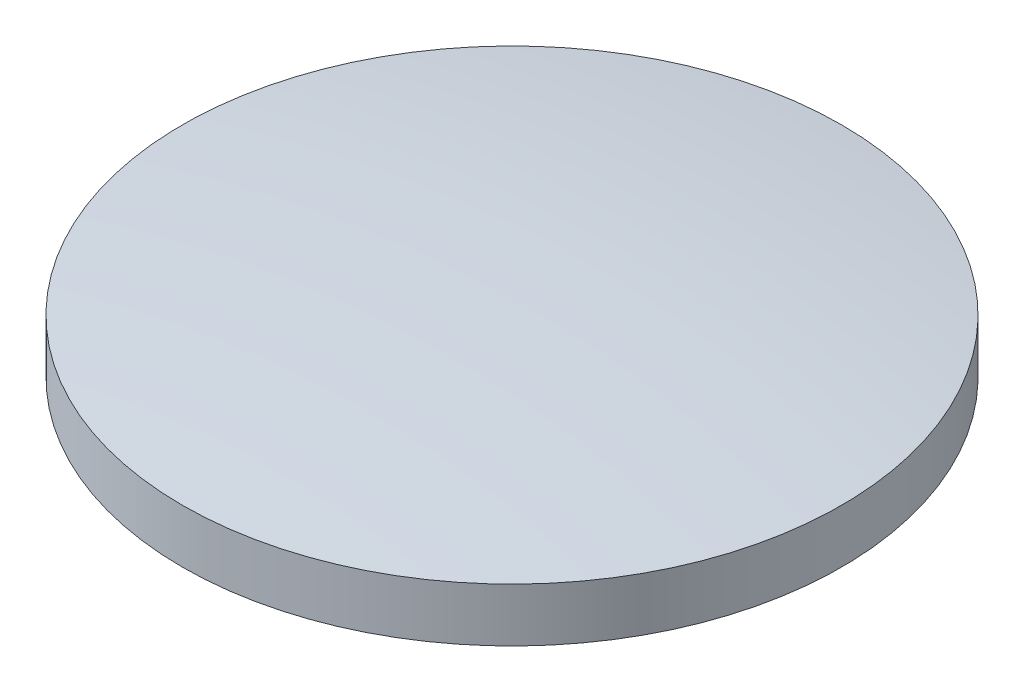
ISO-10303-21;
HEADER;
FILE_DESCRIPTION(('STEP AP214'),'2;1');
FILE_NAME('part.step','',(''),(''),'','','');
FILE_SCHEMA(('AUTOMOTIVE_DESIGN { 1 0 10303 214 1 1 1 1 }'));
ENDSEC;
DATA;
#1=APPLICATION_CONTEXT('core data for automotive mechanical design processes');
#2=APPLICATION_PROTOCOL_DEFINITION('international standard','automotive_design',2000,#1);
#3=PRODUCT_CONTEXT('',#1,'mechanical');
#4=PRODUCT('Part','Part','',(#3));
#5=PRODUCT_RELATED_PRODUCT_CATEGORY('part','',(#4));
#6=PRODUCT_DEFINITION_FORMATION('','',#4);
#7=PRODUCT_DEFINITION_CONTEXT('part definition',#1,'design');
#8=PRODUCT_DEFINITION('design','',#6,#7);
#9=PRODUCT_DEFINITION_SHAPE('','',#8);
#10=(LENGTH_UNIT() NAMED_UNIT(*) SI_UNIT(.MILLI.,.METRE.));
#11=(NAMED_UNIT(*) PLANE_ANGLE_UNIT() SI_UNIT($,.RADIAN.));
#12=(NAMED_UNIT(*) SI_UNIT($,.STERADIAN.) SOLID_ANGLE_UNIT());
#13=UNCERTAINTY_MEASURE_WITH_UNIT(LENGTH_MEASURE(1.E-05),#10,'distance_accuracy_value','');
#14=(GEOMETRIC_REPRESENTATION_CONTEXT(3) GLOBAL_UNCERTAINTY_ASSIGNED_CONTEXT((#13)) GLOBAL_UNIT_ASSIGNED_CONTEXT((#10,
#11,#12)) REPRESENTATION_CONTEXT('',''));
#15=CARTESIAN_POINT('',(0.,0.,0.));
#16=DIRECTION('',(0.,0.,1.));
#17=DIRECTION('',(1.,0.,0.));
#18=AXIS2_PLACEMENT_3D('',#15,#16,#17);
#19=CARTESIAN_POINT('',(0.,-334.252541757358,-0.235829882456937));
#20=DIRECTION('',(-1.,0.,0.));
#21=DIRECTION('',(0.,0.,-1.));
#22=AXIS2_PLACEMENT_3D('',#19,#20,#21);
#23=CIRCLE('',#22,332.000000000004);
#24=TRIMMED_CURVE('',#23,(PARAMETER_VALUE(-1.57150665782589)),
(PARAMETER_VALUE(1.57150665782589)),.T.,.PARAMETER.);
#25=CARTESIAN_POINT('',(0.,-334.252541757358,0.));
#26=DIRECTION('',(0.,-1.,0.));
#27=AXIS1_PLACEMENT('',#25,#26);
#28=SURFACE_OF_REVOLUTION('',#24,#27);
#29=CARTESIAN_POINT('',(0.,-2.25262551599919,0.));
#30=VERTEX_POINT('',#29);
#31=VERTEX_LOOP('',#30);
#32=FACE_BOUND('',#31,.T.);
#33=CARTESIAN_POINT('',(0.,-5.35262551599919,0.));
#34=DIRECTION('',(0.,-1.,0.));
#35=DIRECTION('',(0.,0.,-1.));
#36=AXIS2_PLACEMENT_3D('',#33,#34,#35);
#37=CIRCLE('',#36,45.5);
#38=CARTESIAN_POINT('',(0.,-5.35262551599919,-45.5));
#39=VERTEX_POINT('',#38);
#40=EDGE_CURVE('E11',#39,#39,#37,.T.);
#41=ORIENTED_EDGE('',*,*,#40,.F.);
#42=EDGE_LOOP('',(#41));
#43=FACE_BOUND('',#42,.T.);
#44=ADVANCED_FACE('F35',(#32,#43),#28,.T.);
#45=CARTESIAN_POINT('',(0.,-12.7526255159992,0.));
#46=DIRECTION('',(0.,-1.,0.));
#47=DIRECTION('',(0.,0.,-1.));
#48=AXIS2_PLACEMENT_3D('',#45,#46,#47);
#49=CYLINDRICAL_SURFACE('',#48,45.5);
#50=ORIENTED_EDGE('',*,*,#40,.T.);
#51=EDGE_LOOP('',(#50));
#52=FACE_BOUND('',#51,.T.);
#53=CARTESIAN_POINT('',(0.,-12.7526255159992,0.));
#54=DIRECTION('',(0.,-1.,0.));
#55=DIRECTION('',(0.,0.,-1.));
#56=AXIS2_PLACEMENT_3D('',#53,#54,#55);
#57=CIRCLE('',#56,45.5);
#58=CARTESIAN_POINT('',(0.,-12.7526255159992,-45.5));
#59=VERTEX_POINT('',#58);
#60=EDGE_CURVE('E41',#59,#59,#57,.T.);
#61=ORIENTED_EDGE('',*,*,#60,.F.);
#62=EDGE_LOOP('',(#61));
#63=FACE_BOUND('',#62,.T.);
#64=ADVANCED_FACE('F46',(#52,#63),#49,.T.);
#65=CARTESIAN_POINT('',(45.5,-12.7526255159992,0.));
#66=DIRECTION('',(0.,-1.,0.));
#67=DIRECTION('',(0.,0.,-1.));
#68=AXIS2_PLACEMENT_3D('',#65,#66,#67);
#69=PLANE('',#68);
#70=ORIENTED_EDGE('',*,*,#60,.T.);
#71=EDGE_LOOP('',(#70));
#72=FACE_BOUND('',#71,.T.);
#73=ADVANCED_FACE('F51',(#72),#69,.T.);
#74=CLOSED_SHELL('',(#44,#64,#73));
#75=MANIFOLD_SOLID_BREP('B2',#74);
#76=ADVANCED_BREP_SHAPE_REPRESENTATION('',(#18,#75),#14);
#77=SHAPE_DEFINITION_REPRESENTATION(#9,#76);
ENDSEC;
END-ISO-10303-21;
